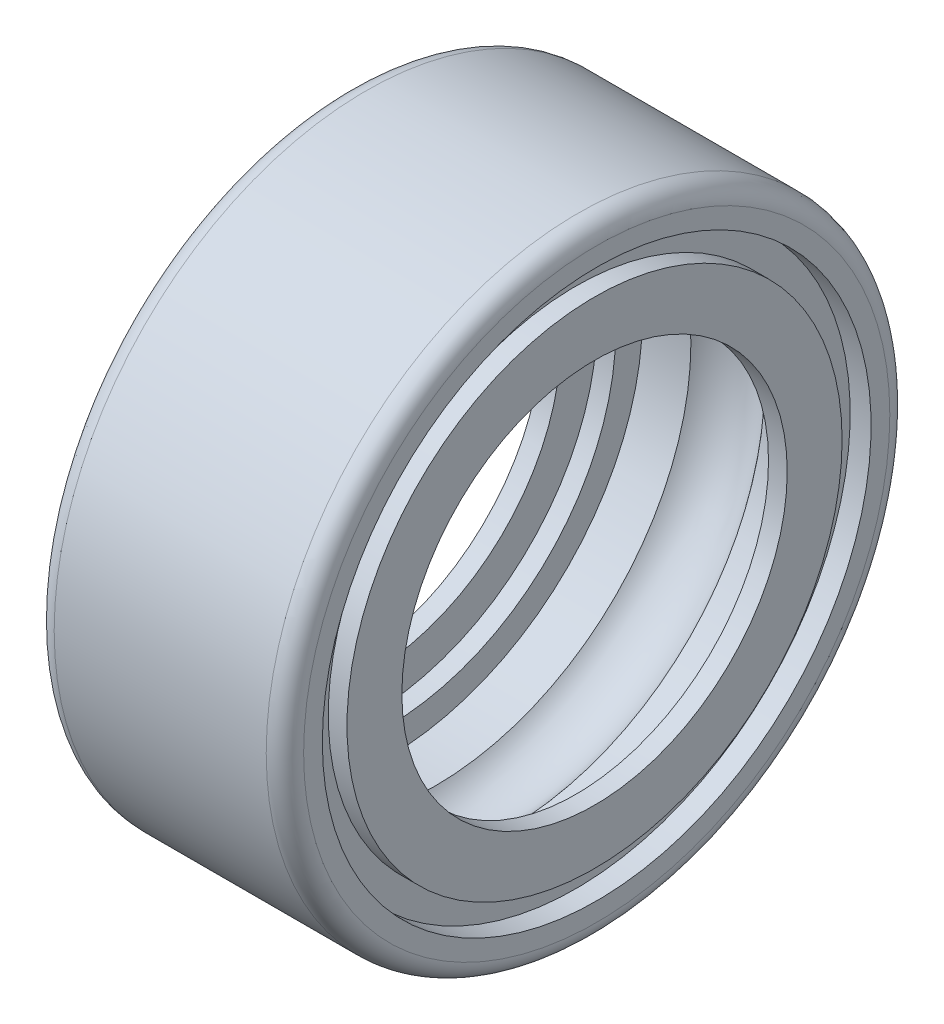
ISO-10303-21;
HEADER;
FILE_DESCRIPTION(('STEP AP214'),'2;1');
FILE_NAME('part.step','',(''),(''),'','','');
FILE_SCHEMA(('AUTOMOTIVE_DESIGN { 1 0 10303 214 1 1 1 1 }'));
ENDSEC;
DATA;
#1=APPLICATION_CONTEXT('core data for automotive mechanical design processes');
#2=APPLICATION_PROTOCOL_DEFINITION('international standard','automotive_design',2000,#1);
#3=PRODUCT_CONTEXT('',#1,'mechanical');
#4=PRODUCT('Part','Part','',(#3));
#5=PRODUCT_RELATED_PRODUCT_CATEGORY('part','',(#4));
#6=PRODUCT_DEFINITION_FORMATION('','',#4);
#7=PRODUCT_DEFINITION_CONTEXT('part definition',#1,'design');
#8=PRODUCT_DEFINITION('design','',#6,#7);
#9=PRODUCT_DEFINITION_SHAPE('','',#8);
#10=(LENGTH_UNIT() NAMED_UNIT(*) SI_UNIT(.MILLI.,.METRE.));
#11=(NAMED_UNIT(*) PLANE_ANGLE_UNIT() SI_UNIT($,.RADIAN.));
#12=(NAMED_UNIT(*) SI_UNIT($,.STERADIAN.) SOLID_ANGLE_UNIT());
#13=UNCERTAINTY_MEASURE_WITH_UNIT(LENGTH_MEASURE(1.E-05),#10,'distance_accuracy_value','');
#14=(GEOMETRIC_REPRESENTATION_CONTEXT(3) GLOBAL_UNCERTAINTY_ASSIGNED_CONTEXT((#13)) GLOBAL_UNIT_ASSIGNED_CONTEXT((#10,
#11,#12)) REPRESENTATION_CONTEXT('',''));
#15=CARTESIAN_POINT('',(0.,0.,0.));
#16=DIRECTION('',(0.,0.,1.));
#17=DIRECTION('',(1.,0.,0.));
#18=AXIS2_PLACEMENT_3D('',#15,#16,#17);
#19=CARTESIAN_POINT('',(59.3,0.,0.));
#20=DIRECTION('',(1.,0.,0.));
#21=DIRECTION('',(0.,0.,1.));
#22=AXIS2_PLACEMENT_3D('',#19,#20,#21);
#23=TOROIDAL_SURFACE('',#22,1.835,0.365);
#24=CARTESIAN_POINT('',(59.0050423759249,0.,0.));
#25=DIRECTION('',(-1.,0.,0.));
#26=DIRECTION('',(0.,0.,1.));
#27=AXIS2_PLACEMENT_3D('',#24,#25,#26);
#28=CIRCLE('',#27,2.05);
#29=CARTESIAN_POINT('',(59.0050423759249,0.,2.05));
#30=VERTEX_POINT('',#29);
#31=EDGE_CURVE('E217',#30,#30,#28,.T.);
#32=ORIENTED_EDGE('',*,*,#31,.T.);
#33=EDGE_LOOP('',(#32));
#34=FACE_BOUND('',#33,.T.);
#35=CARTESIAN_POINT('',(59.5949576240751,0.,0.));
#36=DIRECTION('',(-1.,0.,0.));
#37=DIRECTION('',(0.,0.,1.));
#38=AXIS2_PLACEMENT_3D('',#35,#36,#37);
#39=CIRCLE('',#38,2.05);
#40=CARTESIAN_POINT('',(59.5949576240751,0.,2.05));
#41=VERTEX_POINT('',#40);
#42=EDGE_CURVE('E214',#41,#41,#39,.F.);
#43=ORIENTED_EDGE('',*,*,#42,.T.);
#44=EDGE_LOOP('',(#43));
#45=FACE_BOUND('',#44,.T.);
#46=ADVANCED_FACE('F16',(#34,#45),#23,.F.);
#47=CARTESIAN_POINT('',(58.8112711879625,0.,0.));
#48=DIRECTION('',(-1.,0.,0.));
#49=DIRECTION('',(0.,0.,1.));
#50=AXIS2_PLACEMENT_3D('',#47,#48,#49);
#51=CYLINDRICAL_SURFACE('',#50,2.05);
#52=CARTESIAN_POINT('',(58.6175,0.,0.));
#53=DIRECTION('',(-1.,0.,0.));
#54=DIRECTION('',(0.,0.,1.));
#55=AXIS2_PLACEMENT_3D('',#52,#53,#54);
#56=CIRCLE('',#55,2.05);
#57=CARTESIAN_POINT('',(58.6175,0.,2.05));
#58=VERTEX_POINT('',#57);
#59=EDGE_CURVE('E216',#58,#58,#56,.F.);
#60=ORIENTED_EDGE('',*,*,#59,.F.);
#61=EDGE_LOOP('',(#60));
#62=FACE_BOUND('',#61,.T.);
#63=ORIENTED_EDGE('',*,*,#31,.F.);
#64=EDGE_LOOP('',(#63));
#65=FACE_BOUND('',#64,.T.);
#66=ADVANCED_FACE('F191',(#62,#65),#51,.F.);
#67=CARTESIAN_POINT('',(59.7887288120375,0.,0.));
#68=DIRECTION('',(-1.,0.,0.));
#69=DIRECTION('',(0.,0.,1.));
#70=AXIS2_PLACEMENT_3D('',#67,#68,#69);
#71=CYLINDRICAL_SURFACE('',#70,2.05);
#72=ORIENTED_EDGE('',*,*,#42,.F.);
#73=EDGE_LOOP('',(#72));
#74=FACE_BOUND('',#73,.T.);
#75=CARTESIAN_POINT('',(59.9825,0.,0.));
#76=DIRECTION('',(-1.,0.,0.));
#77=DIRECTION('',(0.,0.,1.));
#78=AXIS2_PLACEMENT_3D('',#75,#76,#77);
#79=CIRCLE('',#78,2.05);
#80=CARTESIAN_POINT('',(59.9825,0.,2.05));
#81=VERTEX_POINT('',#80);
#82=EDGE_CURVE('E268',#81,#81,#79,.T.);
#83=ORIENTED_EDGE('',*,*,#82,.F.);
#84=EDGE_LOOP('',(#83));
#85=FACE_BOUND('',#84,.T.);
#86=ADVANCED_FACE('F188',(#74,#85),#71,.F.);
#87=CARTESIAN_POINT('',(58.6175,0.,2.0175));
#88=DIRECTION('',(1.,0.,0.));
#89=DIRECTION('',(0.,0.,-1.));
#90=AXIS2_PLACEMENT_3D('',#87,#88,#89);
#91=PLANE('',#90);
#92=ORIENTED_EDGE('',*,*,#59,.T.);
#93=EDGE_LOOP('',(#92));
#94=FACE_BOUND('',#93,.T.);
#95=CARTESIAN_POINT('',(58.6175,0.,0.));
#96=DIRECTION('',(-1.,0.,0.));
#97=DIRECTION('',(0.,0.,1.));
#98=AXIS2_PLACEMENT_3D('',#95,#96,#97);
#99=CIRCLE('',#98,1.835);
#100=CARTESIAN_POINT('',(58.6175,0.,1.835));
#101=VERTEX_POINT('',#100);
#102=EDGE_CURVE('E265',#101,#101,#99,.T.);
#103=ORIENTED_EDGE('',*,*,#102,.T.);
#104=EDGE_LOOP('',(#103));
#105=FACE_BOUND('',#104,.T.);
#106=ADVANCED_FACE('F184',(#94,#105),#91,.T.);
#107=CARTESIAN_POINT('',(59.9825,0.,2.0175));
#108=DIRECTION('',(-1.,0.,0.));
#109=DIRECTION('',(0.,0.,1.));
#110=AXIS2_PLACEMENT_3D('',#107,#108,#109);
#111=PLANE('',#110);
#112=ORIENTED_EDGE('',*,*,#82,.T.);
#113=EDGE_LOOP('',(#112));
#114=FACE_BOUND('',#113,.T.);
#115=CARTESIAN_POINT('',(59.9825,0.,0.));
#116=DIRECTION('',(1.,0.,0.));
#117=DIRECTION('',(0.,0.,-1.));
#118=AXIS2_PLACEMENT_3D('',#115,#116,#117);
#119=CIRCLE('',#118,1.835);
#120=CARTESIAN_POINT('',(59.9825,0.,-1.835));
#121=VERTEX_POINT('',#120);
#122=EDGE_CURVE('E262',#121,#121,#119,.T.);
#123=ORIENTED_EDGE('',*,*,#122,.T.);
#124=EDGE_LOOP('',(#123));
#125=FACE_BOUND('',#124,.T.);
#126=ADVANCED_FACE('F180',(#114,#125),#111,.T.);
#127=CARTESIAN_POINT('',(58.5425,0.,0.));
#128=DIRECTION('',(-1.,0.,0.));
#129=DIRECTION('',(0.,0.,1.));
#130=AXIS2_PLACEMENT_3D('',#127,#128,#129);
#131=CYLINDRICAL_SURFACE('',#130,1.835);
#132=CARTESIAN_POINT('',(58.4675,0.,0.));
#133=DIRECTION('',(-1.,0.,0.));
#134=DIRECTION('',(0.,0.,1.));
#135=AXIS2_PLACEMENT_3D('',#132,#133,#134);
#136=CIRCLE('',#135,1.835);
#137=CARTESIAN_POINT('',(58.4675,0.,1.835));
#138=VERTEX_POINT('',#137);
#139=EDGE_CURVE('E259',#138,#138,#136,.F.);
#140=ORIENTED_EDGE('',*,*,#139,.F.);
#141=EDGE_LOOP('',(#140));
#142=FACE_BOUND('',#141,.T.);
#143=ORIENTED_EDGE('',*,*,#102,.F.);
#144=EDGE_LOOP('',(#143));
#145=FACE_BOUND('',#144,.T.);
#146=ADVANCED_FACE('F176',(#142,#145),#131,.F.);
#147=CARTESIAN_POINT('',(60.0575,0.,0.));
#148=DIRECTION('',(1.,0.,0.));
#149=DIRECTION('',(0.,0.,-1.));
#150=AXIS2_PLACEMENT_3D('',#147,#148,#149);
#151=CYLINDRICAL_SURFACE('',#150,1.835);
#152=CARTESIAN_POINT('',(60.1325,0.,0.));
#153=DIRECTION('',(1.,0.,0.));
#154=DIRECTION('',(0.,0.,-1.));
#155=AXIS2_PLACEMENT_3D('',#152,#153,#154);
#156=CIRCLE('',#155,1.835);
#157=CARTESIAN_POINT('',(60.1325,0.,-1.835));
#158=VERTEX_POINT('',#157);
#159=EDGE_CURVE('E256',#158,#158,#156,.F.);
#160=ORIENTED_EDGE('',*,*,#159,.F.);
#161=EDGE_LOOP('',(#160));
#162=FACE_BOUND('',#161,.T.);
#163=ORIENTED_EDGE('',*,*,#122,.F.);
#164=EDGE_LOOP('',(#163));
#165=FACE_BOUND('',#164,.T.);
#166=ADVANCED_FACE('F172',(#162,#165),#151,.F.);
#167=CARTESIAN_POINT('',(58.4675,0.,1.69));
#168=DIRECTION('',(1.,0.,0.));
#169=DIRECTION('',(0.,0.,-1.));
#170=AXIS2_PLACEMENT_3D('',#167,#168,#169);
#171=PLANE('',#170);
#172=ORIENTED_EDGE('',*,*,#139,.T.);
#173=EDGE_LOOP('',(#172));
#174=FACE_BOUND('',#173,.T.);
#175=CARTESIAN_POINT('',(58.4675,0.,0.));
#176=DIRECTION('',(-1.,0.,0.));
#177=DIRECTION('',(0.,0.,1.));
#178=AXIS2_PLACEMENT_3D('',#175,#176,#177);
#179=CIRCLE('',#178,1.545);
#180=CARTESIAN_POINT('',(58.4675,0.,1.545));
#181=VERTEX_POINT('',#180);
#182=EDGE_CURVE('E253',#181,#181,#179,.T.);
#183=ORIENTED_EDGE('',*,*,#182,.T.);
#184=EDGE_LOOP('',(#183));
#185=FACE_BOUND('',#184,.T.);
#186=ADVANCED_FACE('F168',(#174,#185),#171,.T.);
#187=CARTESIAN_POINT('',(60.1325,0.,1.69));
#188=DIRECTION('',(-1.,0.,0.));
#189=DIRECTION('',(0.,0.,1.));
#190=AXIS2_PLACEMENT_3D('',#187,#188,#189);
#191=PLANE('',#190);
#192=ORIENTED_EDGE('',*,*,#159,.T.);
#193=EDGE_LOOP('',(#192));
#194=FACE_BOUND('',#193,.T.);
#195=CARTESIAN_POINT('',(60.1325,0.,0.));
#196=DIRECTION('',(1.,0.,0.));
#197=DIRECTION('',(0.,0.,-1.));
#198=AXIS2_PLACEMENT_3D('',#195,#196,#197);
#199=CIRCLE('',#198,1.545);
#200=CARTESIAN_POINT('',(60.1325,0.,-1.545));
#201=VERTEX_POINT('',#200);
#202=EDGE_CURVE('E250',#201,#201,#199,.T.);
#203=ORIENTED_EDGE('',*,*,#202,.T.);
#204=EDGE_LOOP('',(#203));
#205=FACE_BOUND('',#204,.T.);
#206=ADVANCED_FACE('F164',(#194,#205),#191,.T.);
#207=CARTESIAN_POINT('',(58.3925,0.,0.));
#208=DIRECTION('',(-1.,0.,0.));
#209=DIRECTION('',(0.,0.,1.));
#210=AXIS2_PLACEMENT_3D('',#207,#208,#209);
#211=CYLINDRICAL_SURFACE('',#210,1.545);
#212=CARTESIAN_POINT('',(58.3175,0.,0.));
#213=DIRECTION('',(-1.,0.,0.));
#214=DIRECTION('',(0.,0.,1.));
#215=AXIS2_PLACEMENT_3D('',#212,#213,#214);
#216=CIRCLE('',#215,1.545);
#217=CARTESIAN_POINT('',(58.3175,0.,1.545));
#218=VERTEX_POINT('',#217);
#219=EDGE_CURVE('E247',#218,#218,#216,.F.);
#220=ORIENTED_EDGE('',*,*,#219,.F.);
#221=EDGE_LOOP('',(#220));
#222=FACE_BOUND('',#221,.T.);
#223=ORIENTED_EDGE('',*,*,#182,.F.);
#224=EDGE_LOOP('',(#223));
#225=FACE_BOUND('',#224,.T.);
#226=ADVANCED_FACE('F160',(#222,#225),#211,.F.);
#227=CARTESIAN_POINT('',(60.2075,0.,0.));
#228=DIRECTION('',(1.,0.,0.));
#229=DIRECTION('',(0.,0.,-1.));
#230=AXIS2_PLACEMENT_3D('',#227,#228,#229);
#231=CYLINDRICAL_SURFACE('',#230,1.545);
#232=CARTESIAN_POINT('',(60.2825,0.,0.));
#233=DIRECTION('',(1.,0.,0.));
#234=DIRECTION('',(0.,0.,-1.));
#235=AXIS2_PLACEMENT_3D('',#232,#233,#234);
#236=CIRCLE('',#235,1.545);
#237=CARTESIAN_POINT('',(60.2825,0.,-1.545));
#238=VERTEX_POINT('',#237);
#239=EDGE_CURVE('E244',#238,#238,#236,.F.);
#240=ORIENTED_EDGE('',*,*,#239,.F.);
#241=EDGE_LOOP('',(#240));
#242=FACE_BOUND('',#241,.T.);
#243=ORIENTED_EDGE('',*,*,#202,.F.);
#244=EDGE_LOOP('',(#243));
#245=FACE_BOUND('',#244,.T.);
#246=ADVANCED_FACE('F156',(#242,#245),#231,.F.);
#247=CARTESIAN_POINT('',(58.3175,0.,1.765));
#248=DIRECTION('',(-1.,0.,0.));
#249=DIRECTION('',(0.,0.,1.));
#250=AXIS2_PLACEMENT_3D('',#247,#248,#249);
#251=PLANE('',#250);
#252=ORIENTED_EDGE('',*,*,#219,.T.);
#253=EDGE_LOOP('',(#252));
#254=FACE_BOUND('',#253,.T.);
#255=CARTESIAN_POINT('',(58.3175,0.,0.));
#256=DIRECTION('',(-1.,0.,0.));
#257=DIRECTION('',(0.,0.,1.));
#258=AXIS2_PLACEMENT_3D('',#255,#256,#257);
#259=CIRCLE('',#258,1.985);
#260=CARTESIAN_POINT('',(58.3175,0.,1.985));
#261=VERTEX_POINT('',#260);
#262=EDGE_CURVE('E241',#261,#261,#259,.F.);
#263=ORIENTED_EDGE('',*,*,#262,.F.);
#264=EDGE_LOOP('',(#263));
#265=FACE_BOUND('',#264,.T.);
#266=ADVANCED_FACE('F152',(#254,#265),#251,.T.);
#267=CARTESIAN_POINT('',(60.2825,0.,1.765));
#268=DIRECTION('',(1.,0.,0.));
#269=DIRECTION('',(0.,0.,-1.));
#270=AXIS2_PLACEMENT_3D('',#267,#268,#269);
#271=PLANE('',#270);
#272=ORIENTED_EDGE('',*,*,#239,.T.);
#273=EDGE_LOOP('',(#272));
#274=FACE_BOUND('',#273,.T.);
#275=CARTESIAN_POINT('',(60.2825,0.,0.));
#276=DIRECTION('',(1.,0.,0.));
#277=DIRECTION('',(0.,0.,-1.));
#278=AXIS2_PLACEMENT_3D('',#275,#276,#277);
#279=CIRCLE('',#278,1.985);
#280=CARTESIAN_POINT('',(60.2825,0.,-1.985));
#281=VERTEX_POINT('',#280);
#282=EDGE_CURVE('E238',#281,#281,#279,.F.);
#283=ORIENTED_EDGE('',*,*,#282,.F.);
#284=EDGE_LOOP('',(#283));
#285=FACE_BOUND('',#284,.T.);
#286=ADVANCED_FACE('F148',(#274,#285),#271,.T.);
#287=CARTESIAN_POINT('',(58.3925,0.,0.));
#288=DIRECTION('',(-1.,0.,0.));
#289=DIRECTION('',(0.,0.,1.));
#290=AXIS2_PLACEMENT_3D('',#287,#288,#289);
#291=CYLINDRICAL_SURFACE('',#290,1.985);
#292=CARTESIAN_POINT('',(58.4675,0.,0.));
#293=DIRECTION('',(-1.,0.,0.));
#294=DIRECTION('',(0.,0.,1.));
#295=AXIS2_PLACEMENT_3D('',#292,#293,#294);
#296=CIRCLE('',#295,1.985);
#297=CARTESIAN_POINT('',(58.4675,0.,1.985));
#298=VERTEX_POINT('',#297);
#299=EDGE_CURVE('E235',#298,#298,#296,.F.);
#300=ORIENTED_EDGE('',*,*,#299,.F.);
#301=EDGE_LOOP('',(#300));
#302=FACE_BOUND('',#301,.T.);
#303=ORIENTED_EDGE('',*,*,#262,.T.);
#304=EDGE_LOOP('',(#303));
#305=FACE_BOUND('',#304,.T.);
#306=ADVANCED_FACE('F144',(#302,#305),#291,.T.);
#307=CARTESIAN_POINT('',(60.2075,0.,0.));
#308=DIRECTION('',(1.,0.,0.));
#309=DIRECTION('',(0.,0.,-1.));
#310=AXIS2_PLACEMENT_3D('',#307,#308,#309);
#311=CYLINDRICAL_SURFACE('',#310,1.985);
#312=CARTESIAN_POINT('',(60.1325,0.,0.));
#313=DIRECTION('',(1.,0.,0.));
#314=DIRECTION('',(0.,0.,-1.));
#315=AXIS2_PLACEMENT_3D('',#312,#313,#314);
#316=CIRCLE('',#315,1.985);
#317=CARTESIAN_POINT('',(60.1325,0.,-1.985));
#318=VERTEX_POINT('',#317);
#319=EDGE_CURVE('E232',#318,#318,#316,.F.);
#320=ORIENTED_EDGE('',*,*,#319,.F.);
#321=EDGE_LOOP('',(#320));
#322=FACE_BOUND('',#321,.T.);
#323=ORIENTED_EDGE('',*,*,#282,.T.);
#324=EDGE_LOOP('',(#323));
#325=FACE_BOUND('',#324,.T.);
#326=ADVANCED_FACE('F140',(#322,#325),#311,.T.);
#327=CARTESIAN_POINT('',(58.4675,0.,2.0925));
#328=DIRECTION('',(-1.,0.,0.));
#329=DIRECTION('',(0.,0.,1.));
#330=AXIS2_PLACEMENT_3D('',#327,#328,#329);
#331=PLANE('',#330);
#332=ORIENTED_EDGE('',*,*,#299,.T.);
#333=EDGE_LOOP('',(#332));
#334=FACE_BOUND('',#333,.T.);
#335=CARTESIAN_POINT('',(58.4675,0.,0.));
#336=DIRECTION('',(-1.,0.,0.));
#337=DIRECTION('',(0.,0.,1.));
#338=AXIS2_PLACEMENT_3D('',#335,#336,#337);
#339=CIRCLE('',#338,2.2);
#340=CARTESIAN_POINT('',(58.4675,0.,2.2));
#341=VERTEX_POINT('',#340);
#342=EDGE_CURVE('E229',#341,#341,#339,.T.);
#343=ORIENTED_EDGE('',*,*,#342,.T.);
#344=EDGE_LOOP('',(#343));
#345=FACE_BOUND('',#344,.T.);
#346=ADVANCED_FACE('F136',(#334,#345),#331,.T.);
#347=CARTESIAN_POINT('',(60.1325,0.,2.0925));
#348=DIRECTION('',(1.,0.,0.));
#349=DIRECTION('',(0.,0.,-1.));
#350=AXIS2_PLACEMENT_3D('',#347,#348,#349);
#351=PLANE('',#350);
#352=ORIENTED_EDGE('',*,*,#319,.T.);
#353=EDGE_LOOP('',(#352));
#354=FACE_BOUND('',#353,.T.);
#355=CARTESIAN_POINT('',(60.1325,0.,0.));
#356=DIRECTION('',(-1.,0.,0.));
#357=DIRECTION('',(0.,0.,1.));
#358=AXIS2_PLACEMENT_3D('',#355,#356,#357);
#359=CIRCLE('',#358,2.2);
#360=CARTESIAN_POINT('',(60.1325,0.,2.2));
#361=VERTEX_POINT('',#360);
#362=EDGE_CURVE('E53',#361,#361,#359,.F.);
#363=ORIENTED_EDGE('',*,*,#362,.T.);
#364=EDGE_LOOP('',(#363));
#365=FACE_BOUND('',#364,.T.);
#366=ADVANCED_FACE('F132',(#354,#365),#351,.T.);
#367=CARTESIAN_POINT('',(58.45875,0.,0.));
#368=DIRECTION('',(-1.,0.,0.));
#369=DIRECTION('',(0.,0.,1.));
#370=AXIS2_PLACEMENT_3D('',#367,#368,#369);
#371=CYLINDRICAL_SURFACE('',#370,2.2);
#372=CARTESIAN_POINT('',(58.3,0.,0.));
#373=DIRECTION('',(-1.,0.,0.));
#374=DIRECTION('',(0.,0.,1.));
#375=AXIS2_PLACEMENT_3D('',#372,#373,#374);
#376=CIRCLE('',#375,2.2);
#377=CARTESIAN_POINT('',(58.3,0.,2.2));
#378=VERTEX_POINT('',#377);
#379=EDGE_CURVE('E52',#378,#378,#376,.F.);
#380=ORIENTED_EDGE('',*,*,#379,.F.);
#381=EDGE_LOOP('',(#380));
#382=FACE_BOUND('',#381,.T.);
#383=ORIENTED_EDGE('',*,*,#342,.F.);
#384=EDGE_LOOP('',(#383));
#385=FACE_BOUND('',#384,.T.);
#386=ADVANCED_FACE('F128',(#382,#385),#371,.F.);
#387=CARTESIAN_POINT('',(60.14125,0.,0.));
#388=DIRECTION('',(-1.,0.,0.));
#389=DIRECTION('',(0.,0.,1.));
#390=AXIS2_PLACEMENT_3D('',#387,#388,#389);
#391=CYLINDRICAL_SURFACE('',#390,2.2);
#392=ORIENTED_EDGE('',*,*,#362,.F.);
#393=EDGE_LOOP('',(#392));
#394=FACE_BOUND('',#393,.T.);
#395=CARTESIAN_POINT('',(60.3,0.,0.));
#396=DIRECTION('',(-1.,0.,0.));
#397=DIRECTION('',(0.,0.,1.));
#398=AXIS2_PLACEMENT_3D('',#395,#396,#397);
#399=CIRCLE('',#398,2.2);
#400=CARTESIAN_POINT('',(60.3,0.,2.2));
#401=VERTEX_POINT('',#400);
#402=EDGE_CURVE('E222',#401,#401,#399,.T.);
#403=ORIENTED_EDGE('',*,*,#402,.F.);
#404=EDGE_LOOP('',(#403));
#405=FACE_BOUND('',#404,.T.);
#406=ADVANCED_FACE('F123',(#394,#405),#391,.F.);
#407=CARTESIAN_POINT('',(58.3,0.,-2.275));
#408=DIRECTION('',(-1.,0.,0.));
#409=DIRECTION('',(0.,0.,1.));
#410=AXIS2_PLACEMENT_3D('',#407,#408,#409);
#411=PLANE('',#410);
#412=ORIENTED_EDGE('',*,*,#379,.T.);
#413=EDGE_LOOP('',(#412));
#414=FACE_BOUND('',#413,.T.);
#415=CARTESIAN_POINT('',(58.3,0.,0.));
#416=DIRECTION('',(1.,0.,0.));
#417=DIRECTION('',(0.,0.,-1.));
#418=AXIS2_PLACEMENT_3D('',#415,#416,#417);
#419=CIRCLE('',#418,2.35);
#420=CARTESIAN_POINT('',(58.3,0.,-2.35));
#421=VERTEX_POINT('',#420);
#422=CARTESIAN_POINT('',(58.3,0.,2.35));
#423=VERTEX_POINT('',#422);
#424=EDGE_CURVE('E50',#421,#423,#419,.T.);
#425=ORIENTED_EDGE('',*,*,#424,.F.);
#426=CARTESIAN_POINT('',(58.3,0.,0.));
#427=DIRECTION('',(1.,0.,0.));
#428=DIRECTION('',(0.,0.,1.));
#429=AXIS2_PLACEMENT_3D('',#426,#427,#428);
#430=CIRCLE('',#429,2.35);
#431=EDGE_CURVE('E45',#421,#423,#430,.F.);
#432=ORIENTED_EDGE('',*,*,#431,.T.);
#433=EDGE_LOOP('',(#425,#432));
#434=FACE_BOUND('',#433,.T.);
#435=ADVANCED_FACE('F49',(#414,#434),#411,.T.);
#436=CARTESIAN_POINT('',(60.3,0.,-2.275));
#437=DIRECTION('',(1.,0.,0.));
#438=DIRECTION('',(0.,0.,-1.));
#439=AXIS2_PLACEMENT_3D('',#436,#437,#438);
#440=PLANE('',#439);
#441=CARTESIAN_POINT('',(60.3,0.,0.));
#442=DIRECTION('',(-1.,0.,0.));
#443=DIRECTION('',(0.,0.,1.));
#444=AXIS2_PLACEMENT_3D('',#441,#442,#443);
#445=CIRCLE('',#444,2.35);
#446=CARTESIAN_POINT('',(60.3,0.,2.35));
#447=VERTEX_POINT('',#446);
#448=CARTESIAN_POINT('',(60.3,0.,-2.35));
#449=VERTEX_POINT('',#448);
#450=EDGE_CURVE('E59',#447,#449,#445,.T.);
#451=ORIENTED_EDGE('',*,*,#450,.F.);
#452=CARTESIAN_POINT('',(60.3,0.,0.));
#453=DIRECTION('',(-1.,0.,0.));
#454=DIRECTION('',(0.,0.,-1.));
#455=AXIS2_PLACEMENT_3D('',#452,#453,#454);
#456=CIRCLE('',#455,2.35);
#457=EDGE_CURVE('E36',#447,#449,#456,.F.);
#458=ORIENTED_EDGE('',*,*,#457,.T.);
#459=EDGE_LOOP('',(#451,#458));
#460=FACE_BOUND('',#459,.T.);
#461=ORIENTED_EDGE('',*,*,#402,.T.);
#462=EDGE_LOOP('',(#461));
#463=FACE_BOUND('',#462,.T.);
#464=ADVANCED_FACE('F78',(#460,#463),#440,.T.);
#465=CARTESIAN_POINT('',(58.45,0.,0.));
#466=DIRECTION('',(1.,0.,0.));
#467=DIRECTION('',(0.,0.,1.));
#468=AXIS2_PLACEMENT_3D('',#465,#466,#467);
#469=TOROIDAL_SURFACE('',#468,2.35,0.150000000000001);
#470=ORIENTED_EDGE('',*,*,#424,.T.);
#471=ORIENTED_EDGE('',*,*,#431,.F.);
#472=EDGE_LOOP('',(#470,#471));
#473=FACE_BOUND('',#472,.T.);
#474=CARTESIAN_POINT('',(58.45,0.,0.));
#475=DIRECTION('',(-1.,0.,0.));
#476=DIRECTION('',(0.,0.,1.));
#477=AXIS2_PLACEMENT_3D('',#474,#475,#476);
#478=CIRCLE('',#477,2.5);
#479=CARTESIAN_POINT('',(58.45,0.,2.5));
#480=VERTEX_POINT('',#479);
#481=EDGE_CURVE('E28',#480,#480,#478,.F.);
#482=ORIENTED_EDGE('',*,*,#481,.F.);
#483=EDGE_LOOP('',(#482));
#484=FACE_BOUND('',#483,.T.);
#485=ADVANCED_FACE('F57',(#473,#484),#469,.T.);
#486=CARTESIAN_POINT('',(60.15,0.,0.));
#487=DIRECTION('',(1.,0.,0.));
#488=DIRECTION('',(0.,0.,1.));
#489=AXIS2_PLACEMENT_3D('',#486,#487,#488);
#490=TOROIDAL_SURFACE('',#489,2.35,0.150000000000001);
#491=CARTESIAN_POINT('',(60.15,0.,0.));
#492=DIRECTION('',(-1.,0.,0.));
#493=DIRECTION('',(0.,0.,1.));
#494=AXIS2_PLACEMENT_3D('',#491,#492,#493);
#495=CIRCLE('',#494,2.5);
#496=CARTESIAN_POINT('',(60.15,0.,2.5));
#497=VERTEX_POINT('',#496);
#498=EDGE_CURVE('E11',#497,#497,#495,.T.);
#499=ORIENTED_EDGE('',*,*,#498,.F.);
#500=EDGE_LOOP('',(#499));
#501=FACE_BOUND('',#500,.T.);
#502=ORIENTED_EDGE('',*,*,#450,.T.);
#503=ORIENTED_EDGE('',*,*,#457,.F.);
#504=EDGE_LOOP('',(#502,#503));
#505=FACE_BOUND('',#504,.T.);
#506=ADVANCED_FACE('F77',(#501,#505),#490,.T.);
#507=CARTESIAN_POINT('',(59.3,0.,0.));
#508=DIRECTION('',(-1.,0.,0.));
#509=DIRECTION('',(0.,0.,1.));
#510=AXIS2_PLACEMENT_3D('',#507,#508,#509);
#511=CYLINDRICAL_SURFACE('',#510,2.5);
#512=ORIENTED_EDGE('',*,*,#498,.T.);
#513=EDGE_LOOP('',(#512));
#514=FACE_BOUND('',#513,.T.);
#515=ORIENTED_EDGE('',*,*,#481,.T.);
#516=EDGE_LOOP('',(#515));
#517=FACE_BOUND('',#516,.T.);
#518=ADVANCED_FACE('F202',(#514,#517),#511,.T.);
#519=CLOSED_SHELL('',(#46,#66,#86,#106,#126,#146,#166,#186,#206,#226,#246,#266,#286,#306,#326,
#346,#366,#386,#406,#435,#464,#485,#506,#518));
#520=MANIFOLD_SOLID_BREP('B1',#519);
#521=ADVANCED_BREP_SHAPE_REPRESENTATION('',(#18,#520),#14);
#522=SHAPE_DEFINITION_REPRESENTATION(#9,#521);
ENDSEC;
END-ISO-10303-21;
